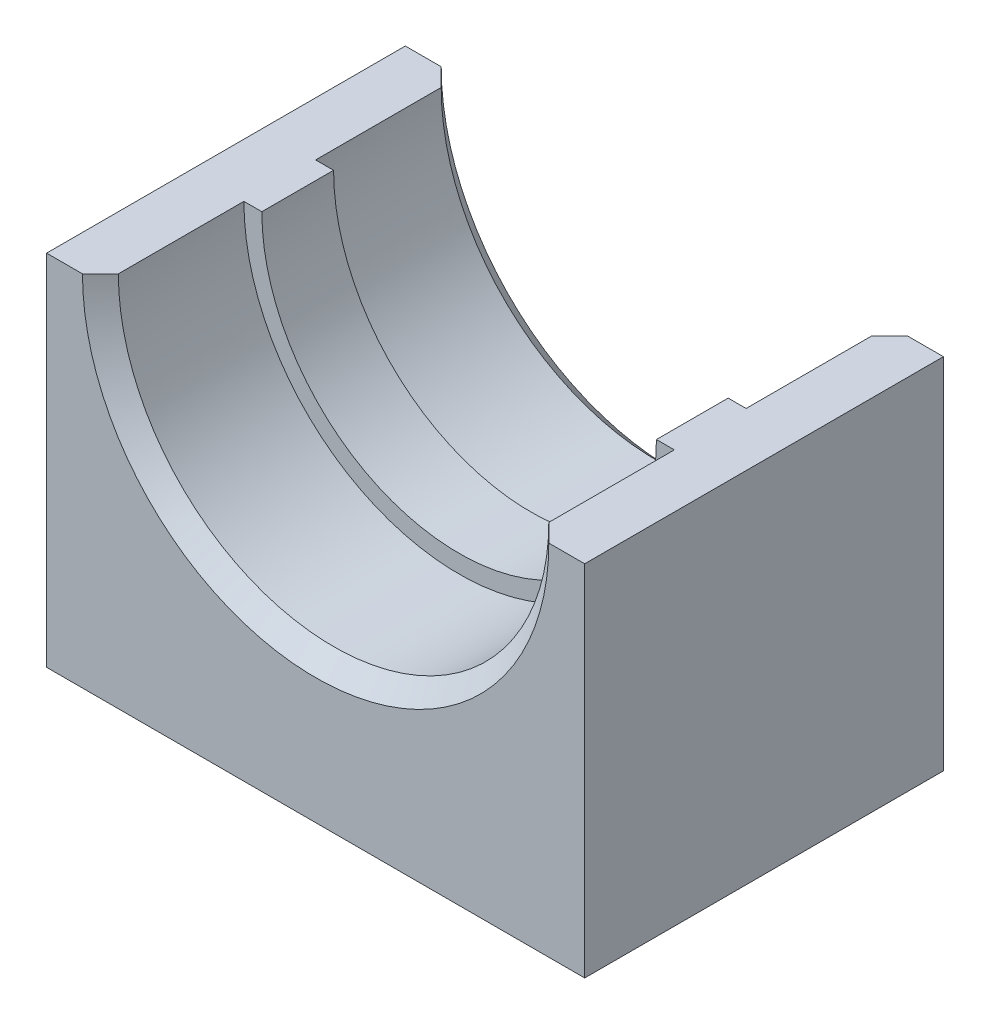
ISO-10303-21;
HEADER;
FILE_DESCRIPTION(('STEP AP214'),'2;1');
FILE_NAME('part.step','',(''),(''),'','','');
FILE_SCHEMA(('AUTOMOTIVE_DESIGN { 1 0 10303 214 1 1 1 1 }'));
ENDSEC;
DATA;
#1=APPLICATION_CONTEXT('core data for automotive mechanical design processes');
#2=APPLICATION_PROTOCOL_DEFINITION('international standard','automotive_design',2000,#1);
#3=PRODUCT_CONTEXT('',#1,'mechanical');
#4=PRODUCT('Part','Part','',(#3));
#5=PRODUCT_RELATED_PRODUCT_CATEGORY('part','',(#4));
#6=PRODUCT_DEFINITION_FORMATION('','',#4);
#7=PRODUCT_DEFINITION_CONTEXT('part definition',#1,'design');
#8=PRODUCT_DEFINITION('design','',#6,#7);
#9=PRODUCT_DEFINITION_SHAPE('','',#8);
#10=(LENGTH_UNIT() NAMED_UNIT(*) SI_UNIT(.MILLI.,.METRE.));
#11=(NAMED_UNIT(*) PLANE_ANGLE_UNIT() SI_UNIT($,.RADIAN.));
#12=(NAMED_UNIT(*) SI_UNIT($,.STERADIAN.) SOLID_ANGLE_UNIT());
#13=UNCERTAINTY_MEASURE_WITH_UNIT(LENGTH_MEASURE(1.E-05),#10,'distance_accuracy_value','');
#14=(GEOMETRIC_REPRESENTATION_CONTEXT(3) GLOBAL_UNCERTAINTY_ASSIGNED_CONTEXT((#13)) GLOBAL_UNIT_ASSIGNED_CONTEXT((#10,
#11,#12)) REPRESENTATION_CONTEXT('',''));
#15=CARTESIAN_POINT('',(0.,0.,0.));
#16=DIRECTION('',(0.,0.,1.));
#17=DIRECTION('',(1.,0.,0.));
#18=AXIS2_PLACEMENT_3D('',#15,#16,#17);
#19=CARTESIAN_POINT('',(-15.,10.,10.));
#20=DIRECTION('',(0.,1.,0.));
#21=DIRECTION('',(0.,0.,1.));
#22=AXIS2_PLACEMENT_3D('',#19,#20,#21);
#23=PLANE('',#22);
#24=DIRECTION('',(0.,0.,-1.));
#25=VECTOR('',#24,1.);
#26=CARTESIAN_POINT('',(-12.,10.,-2.));
#27=LINE('',#26,#25);
#28=CARTESIAN_POINT('',(-12.,10.,-2.));
#29=VERTEX_POINT('',#28);
#30=CARTESIAN_POINT('',(-12.,10.,-9.));
#31=VERTEX_POINT('',#30);
#32=EDGE_CURVE('E263',#29,#31,#27,.T.);
#33=ORIENTED_EDGE('',*,*,#32,.T.);
#34=DIRECTION('',(0.707106781186546,0.,0.707106781186549));
#35=VECTOR('',#34,1.);
#36=CARTESIAN_POINT('',(0.,10.,3.00000000000004));
#37=LINE('',#36,#35);
#38=CARTESIAN_POINT('',(-13.,10.,-10.));
#39=VERTEX_POINT('',#38);
#40=EDGE_CURVE('E172',#31,#39,#37,.F.);
#41=ORIENTED_EDGE('',*,*,#40,.T.);
#42=DIRECTION('',(1.,0.,0.));
#43=VECTOR('',#42,1.);
#44=CARTESIAN_POINT('',(-15.,10.,-10.));
#45=LINE('',#44,#43);
#46=CARTESIAN_POINT('',(-15.,10.,-10.));
#47=VERTEX_POINT('',#46);
#48=EDGE_CURVE('E199',#47,#39,#45,.T.);
#49=ORIENTED_EDGE('',*,*,#48,.F.);
#50=DIRECTION('',(0.,0.,-1.));
#51=VECTOR('',#50,1.);
#52=CARTESIAN_POINT('',(-15.,10.,10.));
#53=LINE('',#52,#51);
#54=CARTESIAN_POINT('',(-15.,10.,10.));
#55=VERTEX_POINT('',#54);
#56=EDGE_CURVE('E157',#55,#47,#53,.T.);
#57=ORIENTED_EDGE('',*,*,#56,.F.);
#58=DIRECTION('',(1.,0.,0.));
#59=VECTOR('',#58,1.);
#60=CARTESIAN_POINT('',(-15.,10.,10.));
#61=LINE('',#60,#59);
#62=CARTESIAN_POINT('',(-13.,10.,10.));
#63=VERTEX_POINT('',#62);
#64=EDGE_CURVE('E178',#55,#63,#61,.T.);
#65=ORIENTED_EDGE('',*,*,#64,.T.);
#66=DIRECTION('',(-0.707106781186546,0.,0.707106781186549));
#67=VECTOR('',#66,1.);
#68=CARTESIAN_POINT('',(0.,10.,-3.00000000000004));
#69=LINE('',#68,#67);
#70=CARTESIAN_POINT('',(-12.,10.,9.));
#71=VERTEX_POINT('',#70);
#72=EDGE_CURVE('E51',#63,#71,#69,.F.);
#73=ORIENTED_EDGE('',*,*,#72,.T.);
#74=DIRECTION('',(0.,0.,1.));
#75=VECTOR('',#74,1.);
#76=CARTESIAN_POINT('',(-12.,10.,2.));
#77=LINE('',#76,#75);
#78=CARTESIAN_POINT('',(-12.,10.,2.));
#79=VERTEX_POINT('',#78);
#80=EDGE_CURVE('E198',#79,#71,#77,.T.);
#81=ORIENTED_EDGE('',*,*,#80,.F.);
#82=DIRECTION('',(1.,0.,0.));
#83=VECTOR('',#82,1.);
#84=CARTESIAN_POINT('',(-15.,10.,2.));
#85=LINE('',#84,#83);
#86=CARTESIAN_POINT('',(-11.,10.,2.));
#87=VERTEX_POINT('',#86);
#88=EDGE_CURVE('E149',#79,#87,#85,.T.);
#89=ORIENTED_EDGE('',*,*,#88,.T.);
#90=DIRECTION('',(0.,0.,1.));
#91=VECTOR('',#90,1.);
#92=CARTESIAN_POINT('',(-11.,10.,-8.));
#93=LINE('',#92,#91);
#94=CARTESIAN_POINT('',(-11.,10.,-2.));
#95=VERTEX_POINT('',#94);
#96=EDGE_CURVE('E130',#95,#87,#93,.T.);
#97=ORIENTED_EDGE('',*,*,#96,.F.);
#98=DIRECTION('',(-1.,0.,0.));
#99=VECTOR('',#98,1.);
#100=CARTESIAN_POINT('',(-15.,10.,-2.));
#101=LINE('',#100,#99);
#102=EDGE_CURVE('E152',#95,#29,#101,.T.);
#103=ORIENTED_EDGE('',*,*,#102,.T.);
#104=EDGE_LOOP('',(#33,#41,#49,#57,#65,#73,#81,#89,#97,#103));
#105=FACE_BOUND('',#104,.T.);
#106=ADVANCED_FACE('F35',(#105),#23,.T.);
#107=CARTESIAN_POINT('',(13.,10.,-10.));
#108=VERTEX_POINT('',#107);
#109=CARTESIAN_POINT('',(15.,10.,-10.));
#110=VERTEX_POINT('',#109);
#111=EDGE_CURVE('E197',#108,#110,#45,.T.);
#112=ORIENTED_EDGE('',*,*,#111,.F.);
#113=DIRECTION('',(0.707106781186546,0.,-0.707106781186549));
#114=VECTOR('',#113,1.);
#115=CARTESIAN_POINT('',(0.,10.,3.00000000000004));
#116=LINE('',#115,#114);
#117=CARTESIAN_POINT('',(12.,10.,-9.));
#118=VERTEX_POINT('',#117);
#119=EDGE_CURVE('E167',#108,#118,#116,.F.);
#120=ORIENTED_EDGE('',*,*,#119,.T.);
#121=DIRECTION('',(0.,0.,-1.));
#122=VECTOR('',#121,1.);
#123=CARTESIAN_POINT('',(12.,10.,-2.));
#124=LINE('',#123,#122);
#125=CARTESIAN_POINT('',(12.,10.,-2.));
#126=VERTEX_POINT('',#125);
#127=EDGE_CURVE('E256',#118,#126,#124,.F.);
#128=ORIENTED_EDGE('',*,*,#127,.T.);
#129=CARTESIAN_POINT('',(11.,10.,-2.));
#130=VERTEX_POINT('',#129);
#131=EDGE_CURVE('E144',#126,#130,#101,.T.);
#132=ORIENTED_EDGE('',*,*,#131,.T.);
#133=DIRECTION('',(0.,0.,1.));
#134=VECTOR('',#133,1.);
#135=CARTESIAN_POINT('',(11.,10.,-8.));
#136=LINE('',#135,#134);
#137=CARTESIAN_POINT('',(11.,10.,2.));
#138=VERTEX_POINT('',#137);
#139=EDGE_CURVE('E127',#138,#130,#136,.F.);
#140=ORIENTED_EDGE('',*,*,#139,.F.);
#141=CARTESIAN_POINT('',(12.,10.,2.));
#142=VERTEX_POINT('',#141);
#143=EDGE_CURVE('E141',#138,#142,#85,.T.);
#144=ORIENTED_EDGE('',*,*,#143,.T.);
#145=DIRECTION('',(0.,0.,1.));
#146=VECTOR('',#145,1.);
#147=CARTESIAN_POINT('',(12.,10.,2.));
#148=LINE('',#147,#146);
#149=CARTESIAN_POINT('',(12.,10.,9.));
#150=VERTEX_POINT('',#149);
#151=EDGE_CURVE('E265',#150,#142,#148,.F.);
#152=ORIENTED_EDGE('',*,*,#151,.F.);
#153=DIRECTION('',(-0.707106781186546,0.,-0.707106781186549));
#154=VECTOR('',#153,1.);
#155=CARTESIAN_POINT('',(0.,10.,-3.00000000000004));
#156=LINE('',#155,#154);
#157=CARTESIAN_POINT('',(13.,10.,10.));
#158=VERTEX_POINT('',#157);
#159=EDGE_CURVE('E165',#150,#158,#156,.F.);
#160=ORIENTED_EDGE('',*,*,#159,.T.);
#161=CARTESIAN_POINT('',(15.,10.,10.));
#162=VERTEX_POINT('',#161);
#163=EDGE_CURVE('E181',#158,#162,#61,.T.);
#164=ORIENTED_EDGE('',*,*,#163,.T.);
#165=DIRECTION('',(0.,0.,-1.));
#166=VECTOR('',#165,1.);
#167=CARTESIAN_POINT('',(15.,10.,10.));
#168=LINE('',#167,#166);
#169=EDGE_CURVE('E208',#162,#110,#168,.T.);
#170=ORIENTED_EDGE('',*,*,#169,.T.);
#171=EDGE_LOOP('',(#112,#120,#128,#132,#140,#144,#152,#160,#164,#170));
#172=FACE_BOUND('',#171,.T.);
#173=ADVANCED_FACE('F139',(#172),#23,.T.);
#174=CARTESIAN_POINT('',(-15.,-10.,10.));
#175=DIRECTION('',(-1.,0.,0.));
#176=DIRECTION('',(0.,0.,1.));
#177=AXIS2_PLACEMENT_3D('',#174,#175,#176);
#178=PLANE('',#177);
#179=DIRECTION('',(0.,1.,0.));
#180=VECTOR('',#179,1.);
#181=CARTESIAN_POINT('',(-15.,-10.,-10.));
#182=LINE('',#181,#180);
#183=CARTESIAN_POINT('',(-15.,-10.,-10.));
#184=VERTEX_POINT('',#183);
#185=EDGE_CURVE('E194',#184,#47,#182,.T.);
#186=ORIENTED_EDGE('',*,*,#185,.F.);
#187=DIRECTION('',(0.,0.,-1.));
#188=VECTOR('',#187,1.);
#189=CARTESIAN_POINT('',(-15.,-10.,10.));
#190=LINE('',#189,#188);
#191=CARTESIAN_POINT('',(-15.,-10.,10.));
#192=VERTEX_POINT('',#191);
#193=EDGE_CURVE('E150',#192,#184,#190,.T.);
#194=ORIENTED_EDGE('',*,*,#193,.F.);
#195=DIRECTION('',(0.,1.,0.));
#196=VECTOR('',#195,1.);
#197=CARTESIAN_POINT('',(-15.,-10.,10.));
#198=LINE('',#197,#196);
#199=EDGE_CURVE('E189',#192,#55,#198,.T.);
#200=ORIENTED_EDGE('',*,*,#199,.T.);
#201=ORIENTED_EDGE('',*,*,#56,.T.);
#202=EDGE_LOOP('',(#186,#194,#200,#201));
#203=FACE_BOUND('',#202,.T.);
#204=ADVANCED_FACE('F213',(#203),#178,.T.);
#205=CARTESIAN_POINT('',(-15.,-10.,10.));
#206=DIRECTION('',(0.,1.,0.));
#207=DIRECTION('',(0.,0.,1.));
#208=AXIS2_PLACEMENT_3D('',#205,#206,#207);
#209=PLANE('',#208);
#210=DIRECTION('',(1.,0.,0.));
#211=VECTOR('',#210,1.);
#212=CARTESIAN_POINT('',(-15.,-10.,-10.));
#213=LINE('',#212,#211);
#214=CARTESIAN_POINT('',(15.,-10.,-10.));
#215=VERTEX_POINT('',#214);
#216=EDGE_CURVE('E205',#184,#215,#213,.T.);
#217=ORIENTED_EDGE('',*,*,#216,.T.);
#218=DIRECTION('',(0.,0.,-1.));
#219=VECTOR('',#218,1.);
#220=CARTESIAN_POINT('',(15.,-10.,10.));
#221=LINE('',#220,#219);
#222=CARTESIAN_POINT('',(15.,-10.,10.));
#223=VERTEX_POINT('',#222);
#224=EDGE_CURVE('E153',#223,#215,#221,.T.);
#225=ORIENTED_EDGE('',*,*,#224,.F.);
#226=DIRECTION('',(1.,0.,0.));
#227=VECTOR('',#226,1.);
#228=CARTESIAN_POINT('',(-15.,-10.,10.));
#229=LINE('',#228,#227);
#230=EDGE_CURVE('E187',#192,#223,#229,.T.);
#231=ORIENTED_EDGE('',*,*,#230,.F.);
#232=ORIENTED_EDGE('',*,*,#193,.T.);
#233=EDGE_LOOP('',(#217,#225,#231,#232));
#234=FACE_BOUND('',#233,.T.);
#235=ADVANCED_FACE('F222',(#234),#209,.F.);
#236=CARTESIAN_POINT('',(15.,-10.,10.));
#237=DIRECTION('',(-1.,0.,0.));
#238=DIRECTION('',(0.,0.,1.));
#239=AXIS2_PLACEMENT_3D('',#236,#237,#238);
#240=PLANE('',#239);
#241=DIRECTION('',(0.,1.,0.));
#242=VECTOR('',#241,1.);
#243=CARTESIAN_POINT('',(15.,-10.,-10.));
#244=LINE('',#243,#242);
#245=EDGE_CURVE('E202',#215,#110,#244,.T.);
#246=ORIENTED_EDGE('',*,*,#245,.T.);
#247=ORIENTED_EDGE('',*,*,#169,.F.);
#248=DIRECTION('',(0.,1.,0.));
#249=VECTOR('',#248,1.);
#250=CARTESIAN_POINT('',(15.,-10.,10.));
#251=LINE('',#250,#249);
#252=EDGE_CURVE('E185',#223,#162,#251,.T.);
#253=ORIENTED_EDGE('',*,*,#252,.F.);
#254=ORIENTED_EDGE('',*,*,#224,.T.);
#255=EDGE_LOOP('',(#246,#247,#253,#254));
#256=FACE_BOUND('',#255,.T.);
#257=ADVANCED_FACE('F226',(#256),#240,.F.);
#258=CARTESIAN_POINT('',(0.,0.,10.));
#259=DIRECTION('',(0.,0.,-1.));
#260=DIRECTION('',(-1.,0.,0.));
#261=AXIS2_PLACEMENT_3D('',#258,#259,#260);
#262=PLANE('',#261);
#263=ORIENTED_EDGE('',*,*,#163,.F.);
#264=CARTESIAN_POINT('',(0.,10.,10.));
#265=DIRECTION('',(0.,0.,-1.));
#266=DIRECTION('',(-1.,0.,0.));
#267=AXIS2_PLACEMENT_3D('',#264,#265,#266);
#268=CIRCLE('',#267,13.);
#269=EDGE_CURVE('E44',#158,#63,#268,.T.);
#270=ORIENTED_EDGE('',*,*,#269,.T.);
#271=ORIENTED_EDGE('',*,*,#64,.F.);
#272=ORIENTED_EDGE('',*,*,#199,.F.);
#273=ORIENTED_EDGE('',*,*,#230,.T.);
#274=ORIENTED_EDGE('',*,*,#252,.T.);
#275=EDGE_LOOP('',(#263,#270,#271,#272,#273,#274));
#276=FACE_BOUND('',#275,.T.);
#277=ADVANCED_FACE('F176',(#276),#262,.F.);
#278=CARTESIAN_POINT('',(0.,0.,-10.));
#279=DIRECTION('',(0.,0.,-1.));
#280=DIRECTION('',(-1.,0.,0.));
#281=AXIS2_PLACEMENT_3D('',#278,#279,#280);
#282=PLANE('',#281);
#283=ORIENTED_EDGE('',*,*,#48,.T.);
#284=CARTESIAN_POINT('',(0.,10.,-10.));
#285=DIRECTION('',(0.,0.,-1.));
#286=DIRECTION('',(-1.,0.,0.));
#287=AXIS2_PLACEMENT_3D('',#284,#285,#286);
#288=CIRCLE('',#287,13.);
#289=EDGE_CURVE('E162',#39,#108,#288,.F.);
#290=ORIENTED_EDGE('',*,*,#289,.T.);
#291=ORIENTED_EDGE('',*,*,#111,.T.);
#292=ORIENTED_EDGE('',*,*,#245,.F.);
#293=ORIENTED_EDGE('',*,*,#216,.F.);
#294=ORIENTED_EDGE('',*,*,#185,.T.);
#295=EDGE_LOOP('',(#283,#290,#291,#292,#293,#294));
#296=FACE_BOUND('',#295,.T.);
#297=ADVANCED_FACE('F218',(#296),#282,.T.);
#298=CARTESIAN_POINT('',(0.,10.,2.));
#299=DIRECTION('',(0.,0.,1.));
#300=DIRECTION('',(1.,0.,0.));
#301=AXIS2_PLACEMENT_3D('',#298,#299,#300);
#302=CYLINDRICAL_SURFACE('',#301,12.);
#303=ORIENTED_EDGE('',*,*,#80,.T.);
#304=CARTESIAN_POINT('',(0.,10.,9.));
#305=DIRECTION('',(0.,0.,-1.));
#306=DIRECTION('',(-1.,0.,0.));
#307=AXIS2_PLACEMENT_3D('',#304,#305,#306);
#308=CIRCLE('',#307,12.);
#309=EDGE_CURVE('E11',#71,#150,#308,.F.);
#310=ORIENTED_EDGE('',*,*,#309,.T.);
#311=ORIENTED_EDGE('',*,*,#151,.T.);
#312=CARTESIAN_POINT('',(0.,10.,2.));
#313=DIRECTION('',(0.,0.,1.));
#314=DIRECTION('',(1.,0.,0.));
#315=AXIS2_PLACEMENT_3D('',#312,#313,#314);
#316=CIRCLE('',#315,12.);
#317=EDGE_CURVE('E148',#79,#142,#316,.T.);
#318=ORIENTED_EDGE('',*,*,#317,.F.);
#319=EDGE_LOOP('',(#303,#310,#311,#318));
#320=FACE_BOUND('',#319,.T.);
#321=ADVANCED_FACE('F271',(#320),#302,.F.);
#322=CARTESIAN_POINT('',(0.,10.,2.));
#323=DIRECTION('',(0.,0.,1.));
#324=DIRECTION('',(1.,0.,0.));
#325=AXIS2_PLACEMENT_3D('',#322,#323,#324);
#326=PLANE('',#325);
#327=CARTESIAN_POINT('',(0.,10.,2.));
#328=DIRECTION('',(0.,0.,1.));
#329=DIRECTION('',(1.,0.,0.));
#330=AXIS2_PLACEMENT_3D('',#327,#328,#329);
#331=CIRCLE('',#330,11.);
#332=EDGE_CURVE('E124',#87,#138,#331,.T.);
#333=ORIENTED_EDGE('',*,*,#332,.F.);
#334=ORIENTED_EDGE('',*,*,#88,.F.);
#335=ORIENTED_EDGE('',*,*,#317,.T.);
#336=ORIENTED_EDGE('',*,*,#143,.F.);
#337=EDGE_LOOP('',(#333,#334,#335,#336));
#338=FACE_BOUND('',#337,.T.);
#339=ADVANCED_FACE('F146',(#338),#326,.T.);
#340=CARTESIAN_POINT('',(0.,10.,-2.));
#341=DIRECTION('',(0.,0.,-1.));
#342=DIRECTION('',(-1.,0.,0.));
#343=AXIS2_PLACEMENT_3D('',#340,#341,#342);
#344=CYLINDRICAL_SURFACE('',#343,12.);
#345=ORIENTED_EDGE('',*,*,#127,.F.);
#346=CARTESIAN_POINT('',(0.,10.,-9.));
#347=DIRECTION('',(0.,0.,-1.));
#348=DIRECTION('',(-1.,0.,0.));
#349=AXIS2_PLACEMENT_3D('',#346,#347,#348);
#350=CIRCLE('',#349,12.);
#351=EDGE_CURVE('E169',#118,#31,#350,.T.);
#352=ORIENTED_EDGE('',*,*,#351,.T.);
#353=ORIENTED_EDGE('',*,*,#32,.F.);
#354=CARTESIAN_POINT('',(0.,10.,-2.));
#355=DIRECTION('',(0.,0.,1.));
#356=DIRECTION('',(1.,0.,0.));
#357=AXIS2_PLACEMENT_3D('',#354,#355,#356);
#358=CIRCLE('',#357,12.);
#359=EDGE_CURVE('E262',#29,#126,#358,.T.);
#360=ORIENTED_EDGE('',*,*,#359,.T.);
#361=EDGE_LOOP('',(#345,#352,#353,#360));
#362=FACE_BOUND('',#361,.T.);
#363=ADVANCED_FACE('F259',(#362),#344,.F.);
#364=CARTESIAN_POINT('',(0.,10.,-2.));
#365=DIRECTION('',(0.,0.,-1.));
#366=DIRECTION('',(1.,0.,0.));
#367=AXIS2_PLACEMENT_3D('',#364,#365,#366);
#368=PLANE('',#367);
#369=CARTESIAN_POINT('',(0.,10.,-2.));
#370=DIRECTION('',(0.,0.,-1.));
#371=DIRECTION('',(-1.,0.,0.));
#372=AXIS2_PLACEMENT_3D('',#369,#370,#371);
#373=CIRCLE('',#372,11.);
#374=EDGE_CURVE('E160',#130,#95,#373,.T.);
#375=ORIENTED_EDGE('',*,*,#374,.F.);
#376=ORIENTED_EDGE('',*,*,#131,.F.);
#377=ORIENTED_EDGE('',*,*,#359,.F.);
#378=ORIENTED_EDGE('',*,*,#102,.F.);
#379=EDGE_LOOP('',(#375,#376,#377,#378));
#380=FACE_BOUND('',#379,.T.);
#381=ADVANCED_FACE('F252',(#380),#368,.T.);
#382=CARTESIAN_POINT('',(0.,10.,-8.));
#383=DIRECTION('',(0.,0.,1.));
#384=DIRECTION('',(1.,0.,0.));
#385=AXIS2_PLACEMENT_3D('',#382,#383,#384);
#386=CYLINDRICAL_SURFACE('',#385,11.);
#387=ORIENTED_EDGE('',*,*,#96,.T.);
#388=ORIENTED_EDGE('',*,*,#332,.T.);
#389=ORIENTED_EDGE('',*,*,#139,.T.);
#390=ORIENTED_EDGE('',*,*,#374,.T.);
#391=EDGE_LOOP('',(#387,#388,#389,#390));
#392=FACE_BOUND('',#391,.T.);
#393=ADVANCED_FACE('F126',(#392),#386,.F.);
#394=CARTESIAN_POINT('',(0.,10.,-10.));
#395=DIRECTION('',(0.,0.,-1.));
#396=DIRECTION('',(-1.,0.,0.));
#397=AXIS2_PLACEMENT_3D('',#394,#395,#396);
#398=CONICAL_SURFACE('',#397,13.,0.785398163397447);
#399=ORIENTED_EDGE('',*,*,#40,.F.);
#400=ORIENTED_EDGE('',*,*,#351,.F.);
#401=ORIENTED_EDGE('',*,*,#119,.F.);
#402=ORIENTED_EDGE('',*,*,#289,.F.);
#403=EDGE_LOOP('',(#399,#400,#401,#402));
#404=FACE_BOUND('',#403,.T.);
#405=ADVANCED_FACE('F243',(#404),#398,.F.);
#406=CARTESIAN_POINT('',(0.,10.,10.));
#407=DIRECTION('',(0.,0.,1.));
#408=DIRECTION('',(1.,0.,0.));
#409=AXIS2_PLACEMENT_3D('',#406,#407,#408);
#410=CONICAL_SURFACE('',#409,13.,0.785398163397447);
#411=ORIENTED_EDGE('',*,*,#159,.F.);
#412=ORIENTED_EDGE('',*,*,#309,.F.);
#413=ORIENTED_EDGE('',*,*,#72,.F.);
#414=ORIENTED_EDGE('',*,*,#269,.F.);
#415=EDGE_LOOP('',(#411,#412,#413,#414));
#416=FACE_BOUND('',#415,.T.);
#417=ADVANCED_FACE('F38',(#416),#410,.F.);
#418=CLOSED_SHELL('',(#106,#173,#204,#235,#257,#277,#297,#321,#339,#363,#381,#393,#405,#417));
#419=MANIFOLD_SOLID_BREP('B2',#418);
#420=ADVANCED_BREP_SHAPE_REPRESENTATION('',(#18,#419),#14);
#421=SHAPE_DEFINITION_REPRESENTATION(#9,#420);
ENDSEC;
END-ISO-10303-21;
